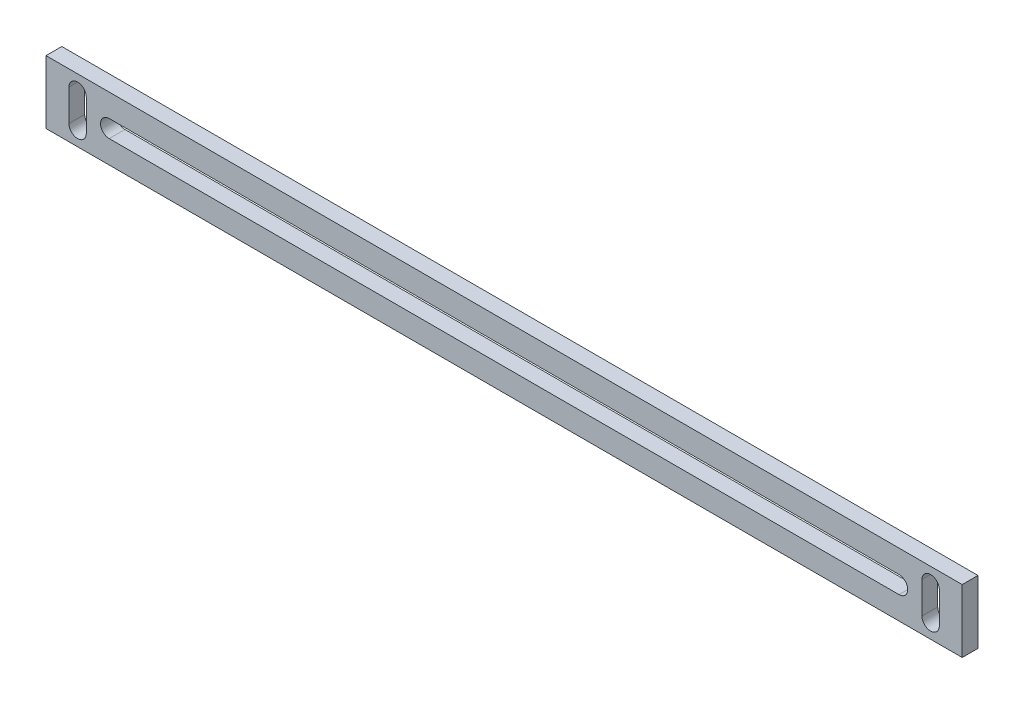
ISO-10303-21;
HEADER;
FILE_DESCRIPTION(('STEP AP214'),'2;1');
FILE_NAME('part.step','',(''),(''),'','','');
FILE_SCHEMA(('AUTOMOTIVE_DESIGN { 1 0 10303 214 1 1 1 1 }'));
ENDSEC;
DATA;
#1=APPLICATION_CONTEXT('core data for automotive mechanical design processes');
#2=APPLICATION_PROTOCOL_DEFINITION('international standard','automotive_design',2000,#1);
#3=PRODUCT_CONTEXT('',#1,'mechanical');
#4=PRODUCT('Part','Part','',(#3));
#5=PRODUCT_RELATED_PRODUCT_CATEGORY('part','',(#4));
#6=PRODUCT_DEFINITION_FORMATION('','',#4);
#7=PRODUCT_DEFINITION_CONTEXT('part definition',#1,'design');
#8=PRODUCT_DEFINITION('design','',#6,#7);
#9=PRODUCT_DEFINITION_SHAPE('','',#8);
#10=(LENGTH_UNIT() NAMED_UNIT(*) SI_UNIT(.MILLI.,.METRE.));
#11=(NAMED_UNIT(*) PLANE_ANGLE_UNIT() SI_UNIT($,.RADIAN.));
#12=(NAMED_UNIT(*) SI_UNIT($,.STERADIAN.) SOLID_ANGLE_UNIT());
#13=UNCERTAINTY_MEASURE_WITH_UNIT(LENGTH_MEASURE(1.E-05),#10,'distance_accuracy_value','');
#14=(GEOMETRIC_REPRESENTATION_CONTEXT(3) GLOBAL_UNCERTAINTY_ASSIGNED_CONTEXT((#13)) GLOBAL_UNIT_ASSIGNED_CONTEXT((#10,
#11,#12)) REPRESENTATION_CONTEXT('',''));
#15=CARTESIAN_POINT('',(0.,0.,0.));
#16=DIRECTION('',(0.,0.,1.));
#17=DIRECTION('',(1.,0.,0.));
#18=AXIS2_PLACEMENT_3D('',#15,#16,#17);
#19=CARTESIAN_POINT('',(0.,0.,5.));
#20=DIRECTION('',(0.,0.,1.));
#21=DIRECTION('',(1.,0.,0.));
#22=AXIS2_PLACEMENT_3D('',#19,#20,#21);
#23=PLANE('',#22);
#24=DIRECTION('',(0.,1.,0.));
#25=VECTOR('',#24,1.);
#26=CARTESIAN_POINT('',(132.25,0.,5.));
#27=LINE('',#26,#25);
#28=CARTESIAN_POINT('',(132.25,-5.00000000000005,5.));
#29=VERTEX_POINT('',#28);
#30=CARTESIAN_POINT('',(132.25,4.99999999999999,5.));
#31=VERTEX_POINT('',#30);
#32=EDGE_CURVE('E161',#29,#31,#27,.T.);
#33=ORIENTED_EDGE('',*,*,#32,.T.);
#34=CARTESIAN_POINT('',(135.,4.99999999999998,5.));
#35=DIRECTION('',(0.,0.,-1.));
#36=DIRECTION('',(-1.,0.,0.));
#37=AXIS2_PLACEMENT_3D('',#34,#35,#36);
#38=CIRCLE('',#37,2.75000000000006);
#39=CARTESIAN_POINT('',(137.75,4.99999999999998,5.));
#40=VERTEX_POINT('',#39);
#41=EDGE_CURVE('E169',#31,#40,#38,.T.);
#42=ORIENTED_EDGE('',*,*,#41,.T.);
#43=DIRECTION('',(0.,1.,0.));
#44=VECTOR('',#43,1.);
#45=CARTESIAN_POINT('',(137.75,0.,5.));
#46=LINE('',#45,#44);
#47=CARTESIAN_POINT('',(137.75,-5.00000000000005,5.));
#48=VERTEX_POINT('',#47);
#49=EDGE_CURVE('E173',#48,#40,#46,.T.);
#50=ORIENTED_EDGE('',*,*,#49,.F.);
#51=CARTESIAN_POINT('',(135.,-5.00000000000005,5.));
#52=DIRECTION('',(0.,0.,-1.));
#53=DIRECTION('',(-1.,0.,0.));
#54=AXIS2_PLACEMENT_3D('',#51,#52,#53);
#55=CIRCLE('',#54,2.75000000000006);
#56=EDGE_CURVE('E166',#48,#29,#55,.T.);
#57=ORIENTED_EDGE('',*,*,#56,.T.);
#58=EDGE_LOOP('',(#33,#42,#50,#57));
#59=FACE_BOUND('',#58,.T.);
#60=DIRECTION('',(-1.,0.,0.));
#61=VECTOR('',#60,1.);
#62=CARTESIAN_POINT('',(0.,-2.75000000000008,5.));
#63=LINE('',#62,#61);
#64=CARTESIAN_POINT('',(125.,-2.75000000000008,5.));
#65=VERTEX_POINT('',#64);
#66=CARTESIAN_POINT('',(-125.,-2.75000000000008,5.));
#67=VERTEX_POINT('',#66);
#68=EDGE_CURVE('E197',#65,#67,#63,.T.);
#69=ORIENTED_EDGE('',*,*,#68,.T.);
#70=CARTESIAN_POINT('',(-125.,0.,5.));
#71=DIRECTION('',(0.,0.,-1.));
#72=DIRECTION('',(-1.,0.,0.));
#73=AXIS2_PLACEMENT_3D('',#70,#71,#72);
#74=CIRCLE('',#73,2.75000000000004);
#75=CARTESIAN_POINT('',(-125.,2.75000000000003,5.));
#76=VERTEX_POINT('',#75);
#77=EDGE_CURVE('E200',#67,#76,#74,.T.);
#78=ORIENTED_EDGE('',*,*,#77,.T.);
#79=DIRECTION('',(-1.,0.,0.));
#80=VECTOR('',#79,1.);
#81=CARTESIAN_POINT('',(0.,2.75,5.));
#82=LINE('',#81,#80);
#83=CARTESIAN_POINT('',(125.,2.75,5.));
#84=VERTEX_POINT('',#83);
#85=EDGE_CURVE('E204',#84,#76,#82,.T.);
#86=ORIENTED_EDGE('',*,*,#85,.F.);
#87=CARTESIAN_POINT('',(125.,0.,5.));
#88=DIRECTION('',(0.,0.,-1.));
#89=DIRECTION('',(-1.,0.,0.));
#90=AXIS2_PLACEMENT_3D('',#87,#88,#89);
#91=CIRCLE('',#90,2.75000000000004);
#92=EDGE_CURVE('E206',#84,#65,#91,.T.);
#93=ORIENTED_EDGE('',*,*,#92,.T.);
#94=EDGE_LOOP('',(#69,#78,#86,#93));
#95=FACE_BOUND('',#94,.T.);
#96=DIRECTION('',(-1.,0.,0.));
#97=VECTOR('',#96,1.);
#98=CARTESIAN_POINT('',(0.,10.,5.));
#99=LINE('',#98,#97);
#100=CARTESIAN_POINT('',(145.,10.,5.));
#101=VERTEX_POINT('',#100);
#102=CARTESIAN_POINT('',(-145.,9.99999999999998,5.));
#103=VERTEX_POINT('',#102);
#104=EDGE_CURVE('E257',#101,#103,#99,.T.);
#105=ORIENTED_EDGE('',*,*,#104,.T.);
#106=DIRECTION('',(0.,-1.,0.));
#107=VECTOR('',#106,1.);
#108=CARTESIAN_POINT('',(-145.,0.,5.));
#109=LINE('',#108,#107);
#110=CARTESIAN_POINT('',(-145.,-9.99999999999998,5.));
#111=VERTEX_POINT('',#110);
#112=EDGE_CURVE('E260',#103,#111,#109,.T.);
#113=ORIENTED_EDGE('',*,*,#112,.T.);
#114=DIRECTION('',(1.,0.,0.));
#115=VECTOR('',#114,1.);
#116=CARTESIAN_POINT('',(0.,-9.99999999999998,5.));
#117=LINE('',#116,#115);
#118=CARTESIAN_POINT('',(145.,-9.99999999999998,5.));
#119=VERTEX_POINT('',#118);
#120=EDGE_CURVE('E263',#111,#119,#117,.T.);
#121=ORIENTED_EDGE('',*,*,#120,.T.);
#122=DIRECTION('',(0.,1.,0.));
#123=VECTOR('',#122,1.);
#124=CARTESIAN_POINT('',(145.,0.,5.));
#125=LINE('',#124,#123);
#126=EDGE_CURVE('E265',#119,#101,#125,.T.);
#127=ORIENTED_EDGE('',*,*,#126,.T.);
#128=EDGE_LOOP('',(#105,#113,#121,#127));
#129=FACE_BOUND('',#128,.T.);
#130=CARTESIAN_POINT('',(-135.,5.00000000000003,5.));
#131=DIRECTION('',(0.,0.,-1.));
#132=DIRECTION('',(-1.,0.,0.));
#133=AXIS2_PLACEMENT_3D('',#130,#131,#132);
#134=CIRCLE('',#133,2.75000000000003);
#135=CARTESIAN_POINT('',(-137.75,5.00000000000004,5.));
#136=VERTEX_POINT('',#135);
#137=CARTESIAN_POINT('',(-132.25,5.00000000000003,5.));
#138=VERTEX_POINT('',#137);
#139=EDGE_CURVE('E235',#136,#138,#134,.T.);
#140=ORIENTED_EDGE('',*,*,#139,.T.);
#141=DIRECTION('',(0.,1.,0.));
#142=VECTOR('',#141,1.);
#143=CARTESIAN_POINT('',(-132.25,0.,5.));
#144=LINE('',#143,#142);
#145=CARTESIAN_POINT('',(-132.25,-4.99999999999994,5.));
#146=VERTEX_POINT('',#145);
#147=EDGE_CURVE('E226',#146,#138,#144,.T.);
#148=ORIENTED_EDGE('',*,*,#147,.F.);
#149=CARTESIAN_POINT('',(-135.,-4.99999999999994,5.));
#150=DIRECTION('',(0.,0.,-1.));
#151=DIRECTION('',(-1.,0.,0.));
#152=AXIS2_PLACEMENT_3D('',#149,#150,#151);
#153=CIRCLE('',#152,2.75000000000003);
#154=CARTESIAN_POINT('',(-137.75,-4.99999999999994,5.));
#155=VERTEX_POINT('',#154);
#156=EDGE_CURVE('E228',#146,#155,#153,.T.);
#157=ORIENTED_EDGE('',*,*,#156,.T.);
#158=DIRECTION('',(0.,1.,0.));
#159=VECTOR('',#158,1.);
#160=CARTESIAN_POINT('',(-137.75,0.,5.));
#161=LINE('',#160,#159);
#162=EDGE_CURVE('E232',#155,#136,#161,.T.);
#163=ORIENTED_EDGE('',*,*,#162,.T.);
#164=EDGE_LOOP('',(#140,#148,#157,#163));
#165=FACE_BOUND('',#164,.T.);
#166=ADVANCED_FACE('F43',(#59,#95,#129,#165),#23,.T.);
#167=CARTESIAN_POINT('',(0.,0.,0.));
#168=DIRECTION('',(0.,0.,1.));
#169=DIRECTION('',(1.,0.,0.));
#170=AXIS2_PLACEMENT_3D('',#167,#168,#169);
#171=PLANE('',#170);
#172=CARTESIAN_POINT('',(135.,4.99999999999998,0.));
#173=DIRECTION('',(0.,0.,-1.));
#174=DIRECTION('',(-1.,0.,0.));
#175=AXIS2_PLACEMENT_3D('',#172,#173,#174);
#176=CIRCLE('',#175,2.75000000000006);
#177=CARTESIAN_POINT('',(132.25,4.99999999999999,0.));
#178=VERTEX_POINT('',#177);
#179=CARTESIAN_POINT('',(137.75,4.99999999999998,0.));
#180=VERTEX_POINT('',#179);
#181=EDGE_CURVE('E186',#178,#180,#176,.T.);
#182=ORIENTED_EDGE('',*,*,#181,.F.);
#183=DIRECTION('',(0.,1.,0.));
#184=VECTOR('',#183,1.);
#185=CARTESIAN_POINT('',(132.25,0.,0.));
#186=LINE('',#185,#184);
#187=CARTESIAN_POINT('',(132.25,-5.00000000000005,0.));
#188=VERTEX_POINT('',#187);
#189=EDGE_CURVE('E164',#188,#178,#186,.T.);
#190=ORIENTED_EDGE('',*,*,#189,.F.);
#191=CARTESIAN_POINT('',(135.,-5.00000000000005,0.));
#192=DIRECTION('',(0.,0.,-1.));
#193=DIRECTION('',(-1.,0.,0.));
#194=AXIS2_PLACEMENT_3D('',#191,#192,#193);
#195=CIRCLE('',#194,2.75000000000006);
#196=CARTESIAN_POINT('',(137.75,-5.00000000000005,0.));
#197=VERTEX_POINT('',#196);
#198=EDGE_CURVE('E177',#197,#188,#195,.T.);
#199=ORIENTED_EDGE('',*,*,#198,.F.);
#200=DIRECTION('',(0.,1.,0.));
#201=VECTOR('',#200,1.);
#202=CARTESIAN_POINT('',(137.75,0.,0.));
#203=LINE('',#202,#201);
#204=EDGE_CURVE('E180',#197,#180,#203,.T.);
#205=ORIENTED_EDGE('',*,*,#204,.T.);
#206=EDGE_LOOP('',(#182,#190,#199,#205));
#207=FACE_BOUND('',#206,.T.);
#208=CARTESIAN_POINT('',(-125.,0.,0.));
#209=DIRECTION('',(0.,0.,-1.));
#210=DIRECTION('',(-1.,0.,0.));
#211=AXIS2_PLACEMENT_3D('',#208,#209,#210);
#212=CIRCLE('',#211,2.75000000000004);
#213=CARTESIAN_POINT('',(-125.,-2.75000000000005,0.));
#214=VERTEX_POINT('',#213);
#215=CARTESIAN_POINT('',(-125.,2.75,0.));
#216=VERTEX_POINT('',#215);
#217=EDGE_CURVE('E212',#214,#216,#212,.T.);
#218=ORIENTED_EDGE('',*,*,#217,.F.);
#219=DIRECTION('',(-1.,0.,0.));
#220=VECTOR('',#219,1.);
#221=CARTESIAN_POINT('',(0.,-2.75000000000008,0.));
#222=LINE('',#221,#220);
#223=CARTESIAN_POINT('',(125.,-2.75000000000008,0.));
#224=VERTEX_POINT('',#223);
#225=EDGE_CURVE('E210',#224,#214,#222,.T.);
#226=ORIENTED_EDGE('',*,*,#225,.F.);
#227=CARTESIAN_POINT('',(125.,0.,0.));
#228=DIRECTION('',(0.,0.,-1.));
#229=DIRECTION('',(-1.,0.,0.));
#230=AXIS2_PLACEMENT_3D('',#227,#228,#229);
#231=CIRCLE('',#230,2.75000000000004);
#232=CARTESIAN_POINT('',(125.,2.75,0.));
#233=VERTEX_POINT('',#232);
#234=EDGE_CURVE('E201',#233,#224,#231,.T.);
#235=ORIENTED_EDGE('',*,*,#234,.F.);
#236=DIRECTION('',(-1.,0.,0.));
#237=VECTOR('',#236,1.);
#238=CARTESIAN_POINT('',(0.,2.75,0.));
#239=LINE('',#238,#237);
#240=EDGE_CURVE('E215',#233,#216,#239,.T.);
#241=ORIENTED_EDGE('',*,*,#240,.T.);
#242=EDGE_LOOP('',(#218,#226,#235,#241));
#243=FACE_BOUND('',#242,.T.);
#244=DIRECTION('',(-1.,0.,0.));
#245=VECTOR('',#244,1.);
#246=CARTESIAN_POINT('',(0.,10.,0.));
#247=LINE('',#246,#245);
#248=CARTESIAN_POINT('',(145.,10.,0.));
#249=VERTEX_POINT('',#248);
#250=CARTESIAN_POINT('',(-145.,9.99999999999998,0.));
#251=VERTEX_POINT('',#250);
#252=EDGE_CURVE('E193',#249,#251,#247,.T.);
#253=ORIENTED_EDGE('',*,*,#252,.F.);
#254=DIRECTION('',(0.,1.,0.));
#255=VECTOR('',#254,1.);
#256=CARTESIAN_POINT('',(145.,0.,0.));
#257=LINE('',#256,#255);
#258=CARTESIAN_POINT('',(145.,-9.99999999999998,0.));
#259=VERTEX_POINT('',#258);
#260=EDGE_CURVE('E261',#259,#249,#257,.T.);
#261=ORIENTED_EDGE('',*,*,#260,.F.);
#262=DIRECTION('',(1.,0.,0.));
#263=VECTOR('',#262,1.);
#264=CARTESIAN_POINT('',(0.,-9.99999999999998,0.));
#265=LINE('',#264,#263);
#266=CARTESIAN_POINT('',(-145.,-9.99999999999998,0.));
#267=VERTEX_POINT('',#266);
#268=EDGE_CURVE('E272',#267,#259,#265,.T.);
#269=ORIENTED_EDGE('',*,*,#268,.F.);
#270=DIRECTION('',(0.,-1.,0.));
#271=VECTOR('',#270,1.);
#272=CARTESIAN_POINT('',(-145.,0.,0.));
#273=LINE('',#272,#271);
#274=EDGE_CURVE('E270',#251,#267,#273,.T.);
#275=ORIENTED_EDGE('',*,*,#274,.F.);
#276=EDGE_LOOP('',(#253,#261,#269,#275));
#277=FACE_BOUND('',#276,.T.);
#278=DIRECTION('',(0.,1.,0.));
#279=VECTOR('',#278,1.);
#280=CARTESIAN_POINT('',(-132.25,0.,0.));
#281=LINE('',#280,#279);
#282=CARTESIAN_POINT('',(-132.25,-4.99999999999994,0.));
#283=VERTEX_POINT('',#282);
#284=CARTESIAN_POINT('',(-132.25,5.00000000000003,0.));
#285=VERTEX_POINT('',#284);
#286=EDGE_CURVE('E239',#283,#285,#281,.T.);
#287=ORIENTED_EDGE('',*,*,#286,.T.);
#288=CARTESIAN_POINT('',(-135.,5.00000000000003,0.));
#289=DIRECTION('',(0.,0.,-1.));
#290=DIRECTION('',(-1.,0.,0.));
#291=AXIS2_PLACEMENT_3D('',#288,#289,#290);
#292=CIRCLE('',#291,2.75000000000003);
#293=CARTESIAN_POINT('',(-137.75,5.00000000000004,0.));
#294=VERTEX_POINT('',#293);
#295=EDGE_CURVE('E229',#294,#285,#292,.T.);
#296=ORIENTED_EDGE('',*,*,#295,.F.);
#297=DIRECTION('',(0.,1.,0.));
#298=VECTOR('',#297,1.);
#299=CARTESIAN_POINT('',(-137.75,0.,0.));
#300=LINE('',#299,#298);
#301=CARTESIAN_POINT('',(-137.75,-4.99999999999994,0.));
#302=VERTEX_POINT('',#301);
#303=EDGE_CURVE('E245',#302,#294,#300,.T.);
#304=ORIENTED_EDGE('',*,*,#303,.F.);
#305=CARTESIAN_POINT('',(-135.,-4.99999999999994,0.));
#306=DIRECTION('',(0.,0.,-1.));
#307=DIRECTION('',(-1.,0.,0.));
#308=AXIS2_PLACEMENT_3D('',#305,#306,#307);
#309=CIRCLE('',#308,2.75000000000003);
#310=EDGE_CURVE('E242',#283,#302,#309,.T.);
#311=ORIENTED_EDGE('',*,*,#310,.F.);
#312=EDGE_LOOP('',(#287,#296,#304,#311));
#313=FACE_BOUND('',#312,.T.);
#314=ADVANCED_FACE('F290',(#207,#243,#277,#313),#171,.F.);
#315=CARTESIAN_POINT('',(0.,10.,5.));
#316=DIRECTION('',(0.,-1.,0.));
#317=DIRECTION('',(1.,0.,0.));
#318=AXIS2_PLACEMENT_3D('',#315,#316,#317);
#319=PLANE('',#318);
#320=ORIENTED_EDGE('',*,*,#252,.T.);
#321=DIRECTION('',(0.,0.,-1.));
#322=VECTOR('',#321,1.);
#323=CARTESIAN_POINT('',(-145.,9.99999999999998,5.));
#324=LINE('',#323,#322);
#325=EDGE_CURVE('E11',#103,#251,#324,.T.);
#326=ORIENTED_EDGE('',*,*,#325,.F.);
#327=ORIENTED_EDGE('',*,*,#104,.F.);
#328=DIRECTION('',(0.,0.,-1.));
#329=VECTOR('',#328,1.);
#330=CARTESIAN_POINT('',(145.,10.,5.));
#331=LINE('',#330,#329);
#332=EDGE_CURVE('E267',#101,#249,#331,.T.);
#333=ORIENTED_EDGE('',*,*,#332,.T.);
#334=EDGE_LOOP('',(#320,#326,#327,#333));
#335=FACE_BOUND('',#334,.T.);
#336=ADVANCED_FACE('F45',(#335),#319,.F.);
#337=CARTESIAN_POINT('',(-145.,0.,5.));
#338=DIRECTION('',(1.,0.,0.));
#339=DIRECTION('',(0.,0.,-1.));
#340=AXIS2_PLACEMENT_3D('',#337,#338,#339);
#341=PLANE('',#340);
#342=ORIENTED_EDGE('',*,*,#274,.T.);
#343=DIRECTION('',(0.,0.,-1.));
#344=VECTOR('',#343,1.);
#345=CARTESIAN_POINT('',(-145.,-9.99999999999998,5.));
#346=LINE('',#345,#344);
#347=EDGE_CURVE('E51',#111,#267,#346,.T.);
#348=ORIENTED_EDGE('',*,*,#347,.F.);
#349=ORIENTED_EDGE('',*,*,#112,.F.);
#350=ORIENTED_EDGE('',*,*,#325,.T.);
#351=EDGE_LOOP('',(#342,#348,#349,#350));
#352=FACE_BOUND('',#351,.T.);
#353=ADVANCED_FACE('F301',(#352),#341,.F.);
#354=CARTESIAN_POINT('',(0.,-9.99999999999998,5.));
#355=DIRECTION('',(0.,1.,0.));
#356=DIRECTION('',(0.,0.,1.));
#357=AXIS2_PLACEMENT_3D('',#354,#355,#356);
#358=PLANE('',#357);
#359=ORIENTED_EDGE('',*,*,#268,.T.);
#360=DIRECTION('',(0.,0.,-1.));
#361=VECTOR('',#360,1.);
#362=CARTESIAN_POINT('',(145.,-9.99999999999998,5.));
#363=LINE('',#362,#361);
#364=EDGE_CURVE('E277',#119,#259,#363,.T.);
#365=ORIENTED_EDGE('',*,*,#364,.F.);
#366=ORIENTED_EDGE('',*,*,#120,.F.);
#367=ORIENTED_EDGE('',*,*,#347,.T.);
#368=EDGE_LOOP('',(#359,#365,#366,#367));
#369=FACE_BOUND('',#368,.T.);
#370=ADVANCED_FACE('F284',(#369),#358,.F.);
#371=CARTESIAN_POINT('',(145.,0.,5.));
#372=DIRECTION('',(-1.,0.,0.));
#373=DIRECTION('',(0.,0.,1.));
#374=AXIS2_PLACEMENT_3D('',#371,#372,#373);
#375=PLANE('',#374);
#376=ORIENTED_EDGE('',*,*,#260,.T.);
#377=ORIENTED_EDGE('',*,*,#332,.F.);
#378=ORIENTED_EDGE('',*,*,#126,.F.);
#379=ORIENTED_EDGE('',*,*,#364,.T.);
#380=EDGE_LOOP('',(#376,#377,#378,#379));
#381=FACE_BOUND('',#380,.T.);
#382=ADVANCED_FACE('F294',(#381),#375,.F.);
#383=CARTESIAN_POINT('',(-132.25,0.,5.));
#384=DIRECTION('',(-1.,0.,0.));
#385=DIRECTION('',(0.,0.,1.));
#386=AXIS2_PLACEMENT_3D('',#383,#384,#385);
#387=PLANE('',#386);
#388=ORIENTED_EDGE('',*,*,#286,.F.);
#389=DIRECTION('',(0.,0.,-1.));
#390=VECTOR('',#389,1.);
#391=CARTESIAN_POINT('',(-132.25,-4.99999999999994,5.));
#392=LINE('',#391,#390);
#393=EDGE_CURVE('E238',#146,#283,#392,.T.);
#394=ORIENTED_EDGE('',*,*,#393,.F.);
#395=ORIENTED_EDGE('',*,*,#147,.T.);
#396=DIRECTION('',(0.,0.,-1.));
#397=VECTOR('',#396,1.);
#398=CARTESIAN_POINT('',(-132.25,5.00000000000003,5.));
#399=LINE('',#398,#397);
#400=EDGE_CURVE('E213',#138,#285,#399,.T.);
#401=ORIENTED_EDGE('',*,*,#400,.T.);
#402=EDGE_LOOP('',(#388,#394,#395,#401));
#403=FACE_BOUND('',#402,.T.);
#404=ADVANCED_FACE('F316',(#403),#387,.T.);
#405=CARTESIAN_POINT('',(-135.,5.00000000000003,5.));
#406=DIRECTION('',(0.,0.,-1.));
#407=DIRECTION('',(-1.,0.,0.));
#408=AXIS2_PLACEMENT_3D('',#405,#406,#407);
#409=CYLINDRICAL_SURFACE('',#408,2.75000000000003);
#410=ORIENTED_EDGE('',*,*,#295,.T.);
#411=ORIENTED_EDGE('',*,*,#400,.F.);
#412=ORIENTED_EDGE('',*,*,#139,.F.);
#413=DIRECTION('',(0.,0.,-1.));
#414=VECTOR('',#413,1.);
#415=CARTESIAN_POINT('',(-137.75,5.00000000000004,5.));
#416=LINE('',#415,#414);
#417=EDGE_CURVE('E251',#136,#294,#416,.T.);
#418=ORIENTED_EDGE('',*,*,#417,.T.);
#419=EDGE_LOOP('',(#410,#411,#412,#418));
#420=FACE_BOUND('',#419,.T.);
#421=ADVANCED_FACE('F323',(#420),#409,.F.);
#422=CARTESIAN_POINT('',(-137.75,0.,5.));
#423=DIRECTION('',(-1.,0.,0.));
#424=DIRECTION('',(0.,0.,1.));
#425=AXIS2_PLACEMENT_3D('',#422,#423,#424);
#426=PLANE('',#425);
#427=ORIENTED_EDGE('',*,*,#303,.T.);
#428=ORIENTED_EDGE('',*,*,#417,.F.);
#429=ORIENTED_EDGE('',*,*,#162,.F.);
#430=DIRECTION('',(0.,0.,-1.));
#431=VECTOR('',#430,1.);
#432=CARTESIAN_POINT('',(-137.75,-4.99999999999994,5.));
#433=LINE('',#432,#431);
#434=EDGE_CURVE('E253',#155,#302,#433,.T.);
#435=ORIENTED_EDGE('',*,*,#434,.T.);
#436=EDGE_LOOP('',(#427,#428,#429,#435));
#437=FACE_BOUND('',#436,.T.);
#438=ADVANCED_FACE('F328',(#437),#426,.F.);
#439=CARTESIAN_POINT('',(-135.,-4.99999999999994,5.));
#440=DIRECTION('',(0.,0.,-1.));
#441=DIRECTION('',(-1.,0.,0.));
#442=AXIS2_PLACEMENT_3D('',#439,#440,#441);
#443=CYLINDRICAL_SURFACE('',#442,2.75000000000003);
#444=ORIENTED_EDGE('',*,*,#310,.T.);
#445=ORIENTED_EDGE('',*,*,#434,.F.);
#446=ORIENTED_EDGE('',*,*,#156,.F.);
#447=ORIENTED_EDGE('',*,*,#393,.T.);
#448=EDGE_LOOP('',(#444,#445,#446,#447));
#449=FACE_BOUND('',#448,.T.);
#450=ADVANCED_FACE('F336',(#449),#443,.F.);
#451=CARTESIAN_POINT('',(0.,-2.75000000000008,5.));
#452=DIRECTION('',(0.,-1.,0.));
#453=DIRECTION('',(1.,0.,0.));
#454=AXIS2_PLACEMENT_3D('',#451,#452,#453);
#455=PLANE('',#454);
#456=ORIENTED_EDGE('',*,*,#225,.T.);
#457=DIRECTION('',(0.,0.,-1.));
#458=VECTOR('',#457,1.);
#459=CARTESIAN_POINT('',(-125.,-2.75000000000008,5.));
#460=LINE('',#459,#458);
#461=EDGE_CURVE('E209',#67,#214,#460,.T.);
#462=ORIENTED_EDGE('',*,*,#461,.F.);
#463=ORIENTED_EDGE('',*,*,#68,.F.);
#464=DIRECTION('',(0.,0.,-1.));
#465=VECTOR('',#464,1.);
#466=CARTESIAN_POINT('',(125.,-2.75000000000008,5.));
#467=LINE('',#466,#465);
#468=EDGE_CURVE('E187',#65,#224,#467,.T.);
#469=ORIENTED_EDGE('',*,*,#468,.T.);
#470=EDGE_LOOP('',(#456,#462,#463,#469));
#471=FACE_BOUND('',#470,.T.);
#472=ADVANCED_FACE('F347',(#471),#455,.F.);
#473=CARTESIAN_POINT('',(125.,0.,5.));
#474=DIRECTION('',(0.,0.,-1.));
#475=DIRECTION('',(-1.,0.,0.));
#476=AXIS2_PLACEMENT_3D('',#473,#474,#475);
#477=CYLINDRICAL_SURFACE('',#476,2.75000000000004);
#478=ORIENTED_EDGE('',*,*,#234,.T.);
#479=ORIENTED_EDGE('',*,*,#468,.F.);
#480=ORIENTED_EDGE('',*,*,#92,.F.);
#481=DIRECTION('',(0.,0.,-1.));
#482=VECTOR('',#481,1.);
#483=CARTESIAN_POINT('',(125.,2.75,5.));
#484=LINE('',#483,#482);
#485=EDGE_CURVE('E221',#84,#233,#484,.T.);
#486=ORIENTED_EDGE('',*,*,#485,.T.);
#487=EDGE_LOOP('',(#478,#479,#480,#486));
#488=FACE_BOUND('',#487,.T.);
#489=ADVANCED_FACE('F351',(#488),#477,.F.);
#490=CARTESIAN_POINT('',(0.,2.75,5.));
#491=DIRECTION('',(0.,-1.,0.));
#492=DIRECTION('',(1.,0.,0.));
#493=AXIS2_PLACEMENT_3D('',#490,#491,#492);
#494=PLANE('',#493);
#495=ORIENTED_EDGE('',*,*,#240,.F.);
#496=ORIENTED_EDGE('',*,*,#485,.F.);
#497=ORIENTED_EDGE('',*,*,#85,.T.);
#498=DIRECTION('',(0.,0.,-1.));
#499=VECTOR('',#498,1.);
#500=CARTESIAN_POINT('',(-125.,2.75,5.));
#501=LINE('',#500,#499);
#502=EDGE_CURVE('E66',#76,#216,#501,.T.);
#503=ORIENTED_EDGE('',*,*,#502,.T.);
#504=EDGE_LOOP('',(#495,#496,#497,#503));
#505=FACE_BOUND('',#504,.T.);
#506=ADVANCED_FACE('F356',(#505),#494,.T.);
#507=CARTESIAN_POINT('',(-125.,0.,5.));
#508=DIRECTION('',(0.,0.,-1.));
#509=DIRECTION('',(-1.,0.,0.));
#510=AXIS2_PLACEMENT_3D('',#507,#508,#509);
#511=CYLINDRICAL_SURFACE('',#510,2.75000000000004);
#512=ORIENTED_EDGE('',*,*,#217,.T.);
#513=ORIENTED_EDGE('',*,*,#502,.F.);
#514=ORIENTED_EDGE('',*,*,#77,.F.);
#515=ORIENTED_EDGE('',*,*,#461,.T.);
#516=EDGE_LOOP('',(#512,#513,#514,#515));
#517=FACE_BOUND('',#516,.T.);
#518=ADVANCED_FACE('F353',(#517),#511,.F.);
#519=CARTESIAN_POINT('',(132.25,0.,5.));
#520=DIRECTION('',(-1.,0.,0.));
#521=DIRECTION('',(0.,0.,1.));
#522=AXIS2_PLACEMENT_3D('',#519,#520,#521);
#523=PLANE('',#522);
#524=ORIENTED_EDGE('',*,*,#189,.T.);
#525=DIRECTION('',(0.,0.,-1.));
#526=VECTOR('',#525,1.);
#527=CARTESIAN_POINT('',(132.25,4.99999999999999,5.));
#528=LINE('',#527,#526);
#529=EDGE_CURVE('E158',#31,#178,#528,.T.);
#530=ORIENTED_EDGE('',*,*,#529,.F.);
#531=ORIENTED_EDGE('',*,*,#32,.F.);
#532=DIRECTION('',(0.,0.,-1.));
#533=VECTOR('',#532,1.);
#534=CARTESIAN_POINT('',(132.25,-5.00000000000005,5.));
#535=LINE('',#534,#533);
#536=EDGE_CURVE('E191',#29,#188,#535,.T.);
#537=ORIENTED_EDGE('',*,*,#536,.T.);
#538=EDGE_LOOP('',(#524,#530,#531,#537));
#539=FACE_BOUND('',#538,.T.);
#540=ADVANCED_FACE('F159',(#539),#523,.F.);
#541=CARTESIAN_POINT('',(135.,-5.00000000000005,5.));
#542=DIRECTION('',(0.,0.,-1.));
#543=DIRECTION('',(-1.,0.,0.));
#544=AXIS2_PLACEMENT_3D('',#541,#542,#543);
#545=CYLINDRICAL_SURFACE('',#544,2.75000000000006);
#546=ORIENTED_EDGE('',*,*,#198,.T.);
#547=ORIENTED_EDGE('',*,*,#536,.F.);
#548=ORIENTED_EDGE('',*,*,#56,.F.);
#549=DIRECTION('',(0.,0.,-1.));
#550=VECTOR('',#549,1.);
#551=CARTESIAN_POINT('',(137.75,-5.00000000000005,5.));
#552=LINE('',#551,#550);
#553=EDGE_CURVE('E194',#48,#197,#552,.T.);
#554=ORIENTED_EDGE('',*,*,#553,.T.);
#555=EDGE_LOOP('',(#546,#547,#548,#554));
#556=FACE_BOUND('',#555,.T.);
#557=ADVANCED_FACE('F365',(#556),#545,.F.);
#558=CARTESIAN_POINT('',(137.75,0.,5.));
#559=DIRECTION('',(-1.,0.,0.));
#560=DIRECTION('',(0.,0.,1.));
#561=AXIS2_PLACEMENT_3D('',#558,#559,#560);
#562=PLANE('',#561);
#563=ORIENTED_EDGE('',*,*,#204,.F.);
#564=ORIENTED_EDGE('',*,*,#553,.F.);
#565=ORIENTED_EDGE('',*,*,#49,.T.);
#566=DIRECTION('',(0.,0.,-1.));
#567=VECTOR('',#566,1.);
#568=CARTESIAN_POINT('',(137.75,4.99999999999998,5.));
#569=LINE('',#568,#567);
#570=EDGE_CURVE('E58',#40,#180,#569,.T.);
#571=ORIENTED_EDGE('',*,*,#570,.T.);
#572=EDGE_LOOP('',(#563,#564,#565,#571));
#573=FACE_BOUND('',#572,.T.);
#574=ADVANCED_FACE('F368',(#573),#562,.T.);
#575=CARTESIAN_POINT('',(135.,4.99999999999998,5.));
#576=DIRECTION('',(0.,0.,-1.));
#577=DIRECTION('',(-1.,0.,0.));
#578=AXIS2_PLACEMENT_3D('',#575,#576,#577);
#579=CYLINDRICAL_SURFACE('',#578,2.75000000000006);
#580=ORIENTED_EDGE('',*,*,#181,.T.);
#581=ORIENTED_EDGE('',*,*,#570,.F.);
#582=ORIENTED_EDGE('',*,*,#41,.F.);
#583=ORIENTED_EDGE('',*,*,#529,.T.);
#584=EDGE_LOOP('',(#580,#581,#582,#583));
#585=FACE_BOUND('',#584,.T.);
#586=ADVANCED_FACE('F170',(#585),#579,.F.);
#587=CLOSED_SHELL('',(#166,#314,#336,#353,#370,#382,#404,#421,#438,#450,#472,#489,#506,#518,
#540,#557,#574,#586));
#588=MANIFOLD_SOLID_BREP('B2',#587);
#589=ADVANCED_BREP_SHAPE_REPRESENTATION('',(#18,#588),#14);
#590=SHAPE_DEFINITION_REPRESENTATION(#9,#589);
ENDSEC;
END-ISO-10303-21;
